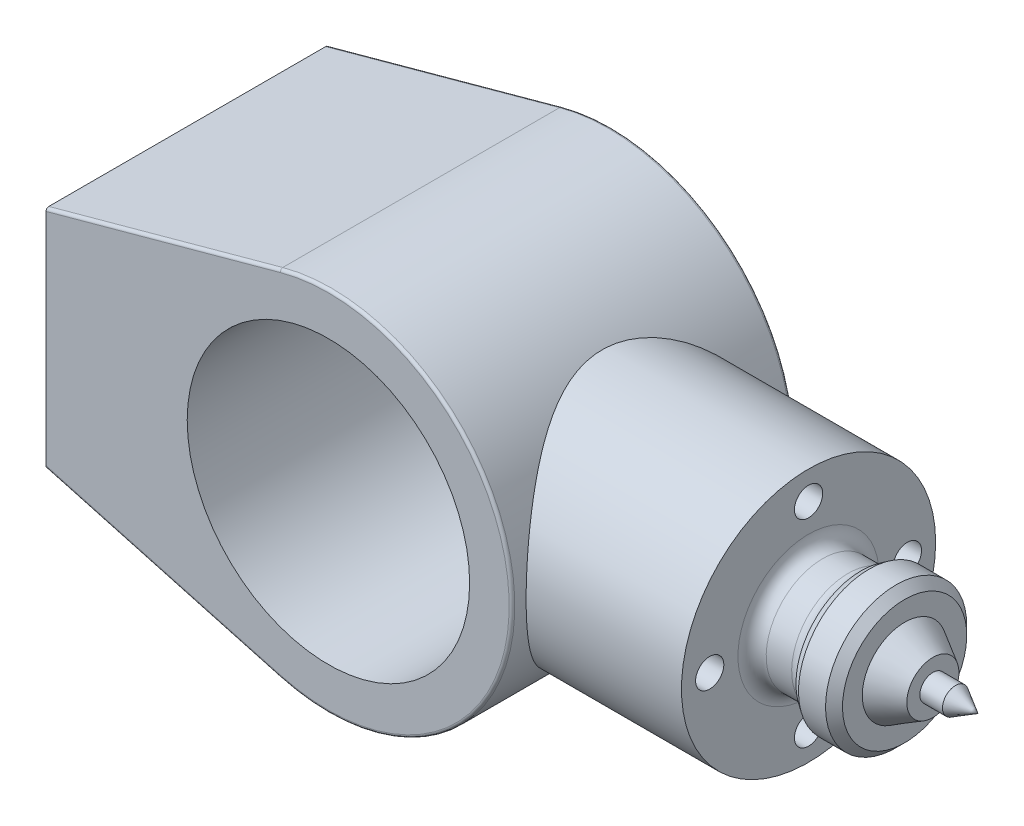
ISO-10303-21;
HEADER;
FILE_DESCRIPTION(('STEP AP214'),'2;1');
FILE_NAME('part.step','',(''),(''),'','','');
FILE_SCHEMA(('AUTOMOTIVE_DESIGN { 1 0 10303 214 1 1 1 1 }'));
ENDSEC;
DATA;
#1=APPLICATION_CONTEXT('core data for automotive mechanical design processes');
#2=APPLICATION_PROTOCOL_DEFINITION('international standard','automotive_design',2000,#1);
#3=PRODUCT_CONTEXT('',#1,'mechanical');
#4=PRODUCT('Part','Part','',(#3));
#5=PRODUCT_RELATED_PRODUCT_CATEGORY('part','',(#4));
#6=PRODUCT_DEFINITION_FORMATION('','',#4);
#7=PRODUCT_DEFINITION_CONTEXT('part definition',#1,'design');
#8=PRODUCT_DEFINITION('design','',#6,#7);
#9=PRODUCT_DEFINITION_SHAPE('','',#8);
#10=(LENGTH_UNIT() NAMED_UNIT(*) SI_UNIT(.MILLI.,.METRE.));
#11=(NAMED_UNIT(*) PLANE_ANGLE_UNIT() SI_UNIT($,.RADIAN.));
#12=(NAMED_UNIT(*) SI_UNIT($,.STERADIAN.) SOLID_ANGLE_UNIT());
#13=UNCERTAINTY_MEASURE_WITH_UNIT(LENGTH_MEASURE(1.E-05),#10,'distance_accuracy_value','');
#14=(GEOMETRIC_REPRESENTATION_CONTEXT(3) GLOBAL_UNCERTAINTY_ASSIGNED_CONTEXT((#13)) GLOBAL_UNIT_ASSIGNED_CONTEXT((#10,
#11,#12)) REPRESENTATION_CONTEXT('',''));
#15=CARTESIAN_POINT('',(0.,0.,0.));
#16=DIRECTION('',(0.,0.,1.));
#17=DIRECTION('',(1.,0.,0.));
#18=AXIS2_PLACEMENT_3D('',#15,#16,#17);
#19=CARTESIAN_POINT('',(0.,0.,50.));
#20=DIRECTION('',(0.,0.,1.));
#21=DIRECTION('',(1.,0.,0.));
#22=AXIS2_PLACEMENT_3D('',#19,#20,#21);
#23=PLANE('',#22);
#24=DIRECTION('',(0.,-1.,0.));
#25=VECTOR('',#24,1.);
#26=CARTESIAN_POINT('',(-100.,-40.,50.));
#27=LINE('',#26,#25);
#28=CARTESIAN_POINT('',(-100.,38.9631546288036,50.));
#29=VERTEX_POINT('',#28);
#30=CARTESIAN_POINT('',(-100.,-38.9631546288037,50.));
#31=VERTEX_POINT('',#30);
#32=EDGE_CURVE('E296',#29,#31,#27,.T.);
#33=ORIENTED_EDGE('',*,*,#32,.T.);
#34=DIRECTION('',(0.964463967125762,-0.264214413149695,0.));
#35=VECTOR('',#34,1.);
#36=CARTESIAN_POINT('',(-16.9097224415805,-61.7256938960488,50.));
#37=LINE('',#36,#35);
#38=CARTESIAN_POINT('',(-16.9097224415805,-61.7256938960488,50.));
#39=VERTEX_POINT('',#38);
#40=EDGE_CURVE('E248',#31,#39,#37,.T.);
#41=ORIENTED_EDGE('',*,*,#40,.T.);
#42=CARTESIAN_POINT('',(0.,0.,50.));
#43=DIRECTION('',(0.,0.,1.));
#44=DIRECTION('',(1.,0.,0.));
#45=AXIS2_PLACEMENT_3D('',#42,#43,#44);
#46=CIRCLE('',#45,64.);
#47=CARTESIAN_POINT('',(-16.9097224415805,61.7256938960488,50.));
#48=VERTEX_POINT('',#47);
#49=EDGE_CURVE('E64',#39,#48,#46,.T.);
#50=ORIENTED_EDGE('',*,*,#49,.T.);
#51=DIRECTION('',(-0.964463967125762,-0.264214413149696,0.));
#52=VECTOR('',#51,1.);
#53=CARTESIAN_POINT('',(-99.7357855868503,39.0355360328742,50.));
#54=LINE('',#53,#52);
#55=EDGE_CURVE('E251',#48,#29,#54,.T.);
#56=ORIENTED_EDGE('',*,*,#55,.T.);
#57=EDGE_LOOP('',(#33,#41,#50,#56));
#58=FACE_BOUND('',#57,.T.);
#59=CARTESIAN_POINT('',(0.,0.,50.));
#60=DIRECTION('',(0.,0.,1.));
#61=DIRECTION('',(1.,0.,0.));
#62=AXIS2_PLACEMENT_3D('',#59,#60,#61);
#63=CIRCLE('',#62,50.);
#64=CARTESIAN_POINT('',(50.,0.,50.));
#65=VERTEX_POINT('',#64);
#66=EDGE_CURVE('E300',#65,#65,#63,.T.);
#67=ORIENTED_EDGE('',*,*,#66,.F.);
#68=EDGE_LOOP('',(#67));
#69=FACE_BOUND('',#68,.T.);
#70=ADVANCED_FACE('F41',(#58,#69),#23,.T.);
#71=CARTESIAN_POINT('',(0.,0.,-50.));
#72=DIRECTION('',(0.,0.,1.));
#73=DIRECTION('',(1.,0.,0.));
#74=AXIS2_PLACEMENT_3D('',#71,#72,#73);
#75=PLANE('',#74);
#76=CARTESIAN_POINT('',(0.,0.,-50.));
#77=DIRECTION('',(0.,0.,1.));
#78=DIRECTION('',(1.,0.,0.));
#79=AXIS2_PLACEMENT_3D('',#76,#77,#78);
#80=CIRCLE('',#79,64.);
#81=CARTESIAN_POINT('',(-16.9097224415805,61.7256938960488,-50.));
#82=VERTEX_POINT('',#81);
#83=CARTESIAN_POINT('',(-16.9097224415805,-61.7256938960488,-50.));
#84=VERTEX_POINT('',#83);
#85=EDGE_CURVE('E269',#82,#84,#80,.F.);
#86=ORIENTED_EDGE('',*,*,#85,.T.);
#87=DIRECTION('',(0.964463967125762,-0.264214413149695,0.));
#88=VECTOR('',#87,1.);
#89=CARTESIAN_POINT('',(-16.9097224415805,-61.7256938960488,-50.));
#90=LINE('',#89,#88);
#91=CARTESIAN_POINT('',(-100.,-38.9631546288037,-50.));
#92=VERTEX_POINT('',#91);
#93=EDGE_CURVE('E265',#84,#92,#90,.F.);
#94=ORIENTED_EDGE('',*,*,#93,.T.);
#95=DIRECTION('',(0.,-1.,0.));
#96=VECTOR('',#95,1.);
#97=CARTESIAN_POINT('',(-100.,-40.,-50.));
#98=LINE('',#97,#96);
#99=CARTESIAN_POINT('',(-100.,38.9631546288037,-50.));
#100=VERTEX_POINT('',#99);
#101=EDGE_CURVE('E297',#100,#92,#98,.T.);
#102=ORIENTED_EDGE('',*,*,#101,.F.);
#103=DIRECTION('',(-0.964463967125762,-0.264214413149696,0.));
#104=VECTOR('',#103,1.);
#105=CARTESIAN_POINT('',(-16.9097224415805,61.7256938960488,-50.));
#106=LINE('',#105,#104);
#107=EDGE_CURVE('E267',#100,#82,#106,.F.);
#108=ORIENTED_EDGE('',*,*,#107,.T.);
#109=EDGE_LOOP('',(#86,#94,#102,#108));
#110=FACE_BOUND('',#109,.T.);
#111=CARTESIAN_POINT('',(0.,0.,-50.));
#112=DIRECTION('',(0.,0.,1.));
#113=DIRECTION('',(1.,0.,0.));
#114=AXIS2_PLACEMENT_3D('',#111,#112,#113);
#115=CIRCLE('',#114,50.);
#116=CARTESIAN_POINT('',(50.,0.,-50.));
#117=VERTEX_POINT('',#116);
#118=EDGE_CURVE('E302',#117,#117,#115,.T.);
#119=ORIENTED_EDGE('',*,*,#118,.T.);
#120=EDGE_LOOP('',(#119));
#121=FACE_BOUND('',#120,.T.);
#122=ADVANCED_FACE('F156',(#110,#121),#75,.F.);
#123=CARTESIAN_POINT('',(-100.,40.,50.));
#124=DIRECTION('',(0.264214413149696,-0.964463967125762,0.));
#125=DIRECTION('',(0.964463967125762,0.264214413149696,0.));
#126=AXIS2_PLACEMENT_3D('',#123,#124,#125);
#127=PLANE('',#126);
#128=DIRECTION('',(0.,0.,-1.));
#129=VECTOR('',#128,1.);
#130=CARTESIAN_POINT('',(-17.1739368547302,62.6901578631745,50.));
#131=LINE('',#130,#129);
#132=CARTESIAN_POINT('',(-17.1739368547302,62.6901578631745,49.));
#133=VERTEX_POINT('',#132);
#134=CARTESIAN_POINT('',(-17.1739368547302,62.6901578631745,-49.));
#135=VERTEX_POINT('',#134);
#136=EDGE_CURVE('E293',#133,#135,#131,.T.);
#137=ORIENTED_EDGE('',*,*,#136,.T.);
#138=DIRECTION('',(-0.964463967125762,-0.264214413149696,0.));
#139=VECTOR('',#138,1.);
#140=CARTESIAN_POINT('',(-100.,40.,-49.));
#141=LINE('',#140,#139);
#142=CARTESIAN_POINT('',(-100.,40.,-49.));
#143=VERTEX_POINT('',#142);
#144=EDGE_CURVE('E253',#135,#143,#141,.T.);
#145=ORIENTED_EDGE('',*,*,#144,.T.);
#146=DIRECTION('',(0.,0.,-1.));
#147=VECTOR('',#146,1.);
#148=CARTESIAN_POINT('',(-100.,40.,50.));
#149=LINE('',#148,#147);
#150=CARTESIAN_POINT('',(-100.,40.,49.));
#151=VERTEX_POINT('',#150);
#152=EDGE_CURVE('E284',#151,#143,#149,.T.);
#153=ORIENTED_EDGE('',*,*,#152,.F.);
#154=DIRECTION('',(-0.964463967125762,-0.264214413149696,0.));
#155=VECTOR('',#154,1.);
#156=CARTESIAN_POINT('',(-17.1739368547302,62.6901578631745,49.));
#157=LINE('',#156,#155);
#158=EDGE_CURVE('E255',#151,#133,#157,.F.);
#159=ORIENTED_EDGE('',*,*,#158,.T.);
#160=EDGE_LOOP('',(#137,#145,#153,#159));
#161=FACE_BOUND('',#160,.T.);
#162=ADVANCED_FACE('F161',(#161),#127,.F.);
#163=CARTESIAN_POINT('',(-100.,-40.,50.));
#164=DIRECTION('',(1.,0.,0.));
#165=DIRECTION('',(0.,1.,0.));
#166=AXIS2_PLACEMENT_3D('',#163,#164,#165);
#167=PLANE('',#166);
#168=ORIENTED_EDGE('',*,*,#101,.T.);
#169=CARTESIAN_POINT('',(-100.,-38.9631546288037,-49.));
#170=DIRECTION('',(1.,0.,0.));
#171=DIRECTION('',(0.,-1.,0.));
#172=AXIS2_PLACEMENT_3D('',#169,#170,#171);
#173=ELLIPSE('',#172,1.03684537119634,1.);
#174=CARTESIAN_POINT('',(-100.,-40.,-49.));
#175=VERTEX_POINT('',#174);
#176=EDGE_CURVE('E257',#92,#175,#173,.F.);
#177=ORIENTED_EDGE('',*,*,#176,.T.);
#178=DIRECTION('',(0.,0.,-1.));
#179=VECTOR('',#178,1.);
#180=CARTESIAN_POINT('',(-100.,-40.,50.));
#181=LINE('',#180,#179);
#182=CARTESIAN_POINT('',(-100.,-40.,49.));
#183=VERTEX_POINT('',#182);
#184=EDGE_CURVE('E287',#183,#175,#181,.T.);
#185=ORIENTED_EDGE('',*,*,#184,.F.);
#186=CARTESIAN_POINT('',(-100.,-38.9631546288037,49.));
#187=DIRECTION('',(1.,0.,0.));
#188=DIRECTION('',(0.,1.,0.));
#189=AXIS2_PLACEMENT_3D('',#186,#187,#188);
#190=ELLIPSE('',#189,1.03684537119634,1.);
#191=EDGE_CURVE('E261',#183,#31,#190,.F.);
#192=ORIENTED_EDGE('',*,*,#191,.T.);
#193=ORIENTED_EDGE('',*,*,#32,.F.);
#194=CARTESIAN_POINT('',(-100.,38.9631546288037,49.));
#195=DIRECTION('',(1.,0.,0.));
#196=DIRECTION('',(0.,1.,0.));
#197=AXIS2_PLACEMENT_3D('',#194,#195,#196);
#198=ELLIPSE('',#197,1.03684537119634,1.);
#199=EDGE_CURVE('E263',#29,#151,#198,.F.);
#200=ORIENTED_EDGE('',*,*,#199,.T.);
#201=ORIENTED_EDGE('',*,*,#152,.T.);
#202=CARTESIAN_POINT('',(-100.,38.9631546288037,-49.));
#203=DIRECTION('',(1.,0.,0.));
#204=DIRECTION('',(0.,-1.,0.));
#205=AXIS2_PLACEMENT_3D('',#202,#203,#204);
#206=ELLIPSE('',#205,1.03684537119634,1.);
#207=EDGE_CURVE('E259',#143,#100,#206,.F.);
#208=ORIENTED_EDGE('',*,*,#207,.T.);
#209=EDGE_LOOP('',(#168,#177,#185,#192,#193,#200,#201,#208));
#210=FACE_BOUND('',#209,.T.);
#211=ADVANCED_FACE('F173',(#210),#167,.F.);
#212=CARTESIAN_POINT('',(-100.,-40.,50.));
#213=DIRECTION('',(0.264214413149695,0.964463967125762,0.));
#214=DIRECTION('',(-0.964463967125762,0.264214413149695,0.));
#215=AXIS2_PLACEMENT_3D('',#212,#213,#214);
#216=PLANE('',#215);
#217=ORIENTED_EDGE('',*,*,#184,.T.);
#218=DIRECTION('',(0.964463967125762,-0.264214413149695,0.));
#219=VECTOR('',#218,1.);
#220=CARTESIAN_POINT('',(-100.,-40.,-49.));
#221=LINE('',#220,#219);
#222=CARTESIAN_POINT('',(-17.1739368547302,-62.6901578631745,-49.));
#223=VERTEX_POINT('',#222);
#224=EDGE_CURVE('E271',#175,#223,#221,.T.);
#225=ORIENTED_EDGE('',*,*,#224,.T.);
#226=DIRECTION('',(0.,0.,-1.));
#227=VECTOR('',#226,1.);
#228=CARTESIAN_POINT('',(-17.1739368547302,-62.6901578631745,50.));
#229=LINE('',#228,#227);
#230=CARTESIAN_POINT('',(-17.1739368547302,-62.6901578631745,49.));
#231=VERTEX_POINT('',#230);
#232=EDGE_CURVE('E290',#231,#223,#229,.T.);
#233=ORIENTED_EDGE('',*,*,#232,.F.);
#234=DIRECTION('',(0.964463967125762,-0.264214413149695,0.));
#235=VECTOR('',#234,1.);
#236=CARTESIAN_POINT('',(-100.,-40.,49.));
#237=LINE('',#236,#235);
#238=EDGE_CURVE('E274',#231,#183,#237,.F.);
#239=ORIENTED_EDGE('',*,*,#238,.T.);
#240=EDGE_LOOP('',(#217,#225,#233,#239));
#241=FACE_BOUND('',#240,.T.);
#242=ADVANCED_FACE('F169',(#241),#216,.F.);
#243=CARTESIAN_POINT('',(0.,0.,50.));
#244=DIRECTION('',(0.,0.,-1.));
#245=DIRECTION('',(-1.,0.,0.));
#246=AXIS2_PLACEMENT_3D('',#243,#244,#245);
#247=CYLINDRICAL_SURFACE('',#246,65.);
#248=CARTESIAN_POINT('',(65.,0.,-45.));
#249=CARTESIAN_POINT('',(65.0000011696057,1.12147330120565,-45.0000012025283));
#250=CARTESIAN_POINT('',(64.9709159765213,2.24292945230778,-44.9580201602482));
#251=CARTESIAN_POINT('',(64.8553068641383,4.47658414079083,-44.790785609369));
#252=CARTESIAN_POINT('',(64.7687842573088,5.58878288911932,-44.6655340035371));
#253=CARTESIAN_POINT('',(64.5403785763002,7.79555151848628,-44.3336771879691));
#254=CARTESIAN_POINT('',(64.3984760503456,8.89011506447751,-44.1270433931238));
#255=CARTESIAN_POINT('',(64.0626457436966,11.0533096019768,-43.6354760134034));
#256=CARTESIAN_POINT('',(63.8687169569864,12.1219400915896,-43.3505409144375));
#257=CARTESIAN_POINT('',(63.4342222744663,14.2212125160506,-42.7078017297046));
#258=CARTESIAN_POINT('',(63.1938918545645,15.2520162370063,-42.3503651251477));
#259=CARTESIAN_POINT('',(62.6709259446924,17.2756280115287,-41.5659763086892));
#260=CARTESIAN_POINT('',(62.3882907364915,18.268436318107,-41.1390245597888));
#261=CARTESIAN_POINT('',(61.7861085539321,20.2116697228795,-40.2199419970838));
#262=CARTESIAN_POINT('',(61.4665619062632,21.1620951960855,-39.7278117601444));
#263=CARTESIAN_POINT('',(60.7962171584065,23.0172309124315,-38.6825647509799));
#264=CARTESIAN_POINT('',(60.4454175300334,23.9219389167185,-38.1294449962195));
#265=CARTESIAN_POINT('',(59.6865648974474,25.7601880140228,-36.9151737617935));
#266=CARTESIAN_POINT('',(59.27618815402,26.6893215363404,-36.2488040005491));
#267=CARTESIAN_POINT('',(58.4330275057249,28.4880338622967,-34.8529502059224));
#268=CARTESIAN_POINT('',(58.0002425478182,29.3576098626539,-34.1234632053608));
#269=CARTESIAN_POINT('',(57.1195111836478,31.0364486388513,-32.6040251352403));
#270=CARTESIAN_POINT('',(56.6715447181891,31.8456267033452,-31.8139921794122));
#271=CARTESIAN_POINT('',(55.7691986061138,33.4006700551814,-30.1773036556993));
#272=CARTESIAN_POINT('',(55.3148185876119,34.1465316534289,-29.330644793672));
#273=CARTESIAN_POINT('',(54.3303114345595,35.6959084068904,-27.4326466159467));
#274=CARTESIAN_POINT('',(53.8005937511269,36.4872853280241,-26.3711450656526));
#275=CARTESIAN_POINT('',(52.7593327891933,37.9773509509911,-24.17604025639));
#276=CARTESIAN_POINT('',(52.2477941160227,38.6760162868262,-23.0424189272517));
#277=CARTESIAN_POINT('',(51.2608149265044,39.9749077721744,-20.7072341856928));
#278=CARTESIAN_POINT('',(50.7853275075273,40.5752630453964,-19.5057627267966));
#279=CARTESIAN_POINT('',(49.8892399163793,41.6721166930025,-17.036931864064));
#280=CARTESIAN_POINT('',(49.4686114171659,42.1686687478853,-15.7696069409943));
#281=CARTESIAN_POINT('',(48.8208029416879,42.9149535309565,-13.5723996352816));
#282=CARTESIAN_POINT('',(48.5738420263558,43.1936925213245,-12.6581208440976));
#283=CARTESIAN_POINT('',(48.1238801744123,43.6944569649788,-10.803538922355));
#284=CARTESIAN_POINT('',(47.920872102193,43.9164916250901,-9.86324004407417));
#285=CARTESIAN_POINT('',(47.5660754926548,44.3005296261305,-7.96250438663407));
#286=CARTESIAN_POINT('',(47.4142038087044,44.4626304606427,-7.00210302149485));
#287=CARTESIAN_POINT('',(47.1671263845177,44.7246555122386,-5.06554052628515));
#288=CARTESIAN_POINT('',(47.071920625953,44.824579749433,-4.08937940131222));
#289=CARTESIAN_POINT('',(46.9418899090944,44.9607388198673,-2.12323648479669));
#290=CARTESIAN_POINT('',(46.9073939345417,44.9966266570423,-1.13320851844657));
#291=CARTESIAN_POINT('',(46.9013571135477,45.0029190462422,0.84724837709386));
#292=CARTESIAN_POINT('',(46.9298161498632,44.9733237202183,1.83767730553401));
#293=CARTESIAN_POINT('',(47.0484302849821,44.8492190899201,3.81128752429083));
#294=CARTESIAN_POINT('',(47.1386230552101,44.7546701492421,4.79446401850663));
#295=CARTESIAN_POINT('',(47.376831317608,44.5024241630868,6.74551496467457));
#296=CARTESIAN_POINT('',(47.5248480621438,44.3447257499009,7.71338908473169));
#297=CARTESIAN_POINT('',(47.8621764271841,43.9803320764262,9.56919366964686));
#298=CARTESIAN_POINT('',(48.0484149088864,43.7772163066585,10.4583970625519));
#299=CARTESIAN_POINT('',(48.4609441046406,43.32010640119,12.2144143492181));
#300=CARTESIAN_POINT('',(48.6872496045115,43.0660934784814,13.0812198417583));
#301=CARTESIAN_POINT('',(49.1738509640383,42.5096331932465,14.7898225666927));
#302=CARTESIAN_POINT('',(49.4341648638834,42.2071601049958,15.6316062329481));
#303=CARTESIAN_POINT('',(49.9825182796335,41.5563350032135,17.2876417419013));
#304=CARTESIAN_POINT('',(50.2705534011697,41.2079902580444,18.1018979206949));
#305=CARTESIAN_POINT('',(51.0225431471345,40.2767822129268,20.1137766396802));
#306=CARTESIAN_POINT('',(51.5007434523329,39.6654891440572,21.2930273345177));
#307=CARTESIAN_POINT('',(52.4891158781477,38.348029920852,23.5833678403921));
#308=CARTESIAN_POINT('',(52.9993005340589,37.6418264436726,24.6944305853524));
#309=CARTESIAN_POINT('',(54.0361557973494,36.1376496350166,26.8476775780095));
#310=CARTESIAN_POINT('',(54.5628535785461,35.3395185623559,27.8897384505711));
#311=CARTESIAN_POINT('',(55.6171804467178,33.6558443419671,29.8998791095632));
#312=CARTESIAN_POINT('',(56.1448094104418,32.7703120184234,30.8679680307498));
#313=CARTESIAN_POINT('',(57.1932449701135,30.9045304086319,32.7363921475658));
#314=CARTESIAN_POINT('',(57.7139191350983,29.9233731295192,33.6358963165067));
#315=CARTESIAN_POINT('',(58.7296419536465,27.8771206485979,35.350355349792));
#316=CARTESIAN_POINT('',(59.2246882700661,26.8120178135979,36.1653025097018));
#317=CARTESIAN_POINT('',(60.1756566955639,24.6035209522421,37.7024332048813));
#318=CARTESIAN_POINT('',(60.6316475651596,23.4602711709794,38.4247809320632));
#319=CARTESIAN_POINT('',(61.4931891608211,21.0989507187335,39.7703323765769));
#320=CARTESIAN_POINT('',(61.898755017873,19.8809026570889,40.3935658507715));
#321=CARTESIAN_POINT('',(62.5646802947783,17.6549035875762,41.4059204565395));
#322=CARTESIAN_POINT('',(62.8372982548467,16.6602403417733,41.8163120535009));
#323=CARTESIAN_POINT('',(63.3397164077328,14.6345031625144,42.5675669112335));
#324=CARTESIAN_POINT('',(63.5695225359981,13.603434299959,42.9084398107234));
#325=CARTESIAN_POINT('',(63.9815049902597,11.5110112910016,43.5164676119118));
#326=CARTESIAN_POINT('',(64.1637052650744,10.4496726714621,43.7836595836378));
#327=CARTESIAN_POINT('',(64.476639865795,8.30296993183372,44.2409869387356));
#328=CARTESIAN_POINT('',(64.6073730982257,7.21760530180254,44.431120684921));
#329=CARTESIAN_POINT('',(64.8147345736683,5.02649787175024,44.7321113931983));
#330=CARTESIAN_POINT('',(64.8911534961694,3.92069290489764,44.8426616714377));
#331=CARTESIAN_POINT('',(64.9872183357686,1.70145350776209,44.981563734156));
#332=CARTESIAN_POINT('',(65.0068642771874,0.588019080747705,45.0099155538474));
#333=CARTESIAN_POINT('',(64.9889001241945,-1.63741781931565,44.9839662509349));
#334=CARTESIAN_POINT('',(64.9512898349751,-2.74942028747966,44.929664847113));
#335=CARTESIAN_POINT('',(64.819734418053,-4.96298947367602,44.7392747901952));
#336=CARTESIAN_POINT('',(64.7257910494465,-6.06455651648126,44.6031886909653));
#337=CARTESIAN_POINT('',(64.491175703309,-8.18254449212148,44.2620157992034));
#338=CARTESIAN_POINT('',(64.3536808680178,-9.20007959997772,44.0616107864454));
#339=CARTESIAN_POINT('',(64.0337856060908,-11.2121337136588,43.5930613516679));
#340=CARTESIAN_POINT('',(63.85138738555,-12.2066538475799,43.3249202574929));
#341=CARTESIAN_POINT('',(63.4451725249075,-14.1673074608523,42.7239854011605));
#342=CARTESIAN_POINT('',(63.2213525684632,-15.1334386601222,42.3911864622048));
#343=CARTESIAN_POINT('',(62.7363363526771,-17.0327019487273,41.6643868113868));
#344=CARTESIAN_POINT('',(62.4751380044848,-17.965832190203,41.2703826790343));
#345=CARTESIAN_POINT('',(61.8990085085122,-19.8637431772395,40.3931275129008));
#346=CARTESIAN_POINT('',(61.5815209528501,-20.8256806929253,39.9054081529014));
#347=CARTESIAN_POINT('',(60.9142086391395,-22.7035764997345,38.8677076181211));
#348=CARTESIAN_POINT('',(60.5643826081083,-23.6195329786528,38.3177239921568));
#349=CARTESIAN_POINT('',(59.8381347129401,-25.4032558353403,37.1592008079418));
#350=CARTESIAN_POINT('',(59.4616987975441,-26.270996314329,36.5506302507532));
#351=CARTESIAN_POINT('',(58.6884577670336,-27.9557544991496,35.2787474176625));
#352=CARTESIAN_POINT('',(58.2916515549571,-28.7727694681138,34.6154321925309));
#353=CARTESIAN_POINT('',(57.4151711853793,-30.4889708749912,33.1199200847161));
#354=CARTESIAN_POINT('',(56.9328754552547,-31.3785212006928,32.2781812569548));
#355=CARTESIAN_POINT('',(55.9590893109094,-33.083904221517,30.5278352445589));
#356=CARTESIAN_POINT('',(55.467597542125,-33.8997259516808,29.6192181500899));
#357=CARTESIAN_POINT('',(54.4860350387397,-35.45586994741,27.7375714933992));
#358=CARTESIAN_POINT('',(53.9959654596118,-36.1961418986443,26.7644997080006));
#359=CARTESIAN_POINT('',(53.0294834997435,-37.5978502361012,24.7568233036381));
#360=CARTESIAN_POINT('',(52.553069328415,-38.2592969946585,23.7222268074148));
#361=CARTESIAN_POINT('',(51.6799413477261,-39.4291013564639,21.7149007388747));
#362=CARTESIAN_POINT('',(51.2803372484816,-39.9463152685162,20.7485884228094));
#363=CARTESIAN_POINT('',(50.5123974548912,-40.913063666173,18.7705314851885));
#364=CARTESIAN_POINT('',(50.1440619804653,-41.3625976757848,17.7587865441704));
#365=CARTESIAN_POINT('',(49.4504928922364,-42.1893301292689,15.693797265063));
#366=CARTESIAN_POINT('',(49.1251906412473,-42.566644202947,14.6406225749502));
#367=CARTESIAN_POINT('',(48.5290098021012,-43.2451098617227,12.4950157035288));
#368=CARTESIAN_POINT('',(48.2581179989953,-43.5462799449171,11.4025931307277));
#369=CARTESIAN_POINT('',(47.8271610412376,-44.018687486118,9.3921629994351));
#370=CARTESIAN_POINT('',(47.6558419905219,-44.2036946073207,8.4797935357042));
#371=CARTESIAN_POINT('',(47.3627606953032,-44.517583244497,6.63757582668246));
#372=CARTESIAN_POINT('',(47.2409923142224,-44.6464717105955,5.70772976070374));
#373=CARTESIAN_POINT('',(47.05166615705,-44.8459556683364,3.83718735816971));
#374=CARTESIAN_POINT('',(46.9840561376509,-44.9166073394187,2.89650236820514));
#375=CARTESIAN_POINT('',(46.9055698265682,-44.9985645522097,1.01014116515035));
#376=CARTESIAN_POINT('',(46.8946943314281,-45.0098692606967,0.0644648821697848));
#377=CARTESIAN_POINT('',(46.9301408777119,-44.972908524549,-1.82506201386805));
#378=CARTESIAN_POINT('',(46.9764888551696,-44.9246160680299,-2.76891160474203));
#379=CARTESIAN_POINT('',(47.1245232303033,-44.7693052695385,-4.64731891289864));
#380=CARTESIAN_POINT('',(47.226209296244,-44.6622872796082,-5.58187668584875));
#381=CARTESIAN_POINT('',(47.4811423262629,-44.3911660407895,-7.4366659860656));
#382=CARTESIAN_POINT('',(47.634452919394,-44.2269923369625,-8.35687836049678));
#383=CARTESIAN_POINT('',(47.9871889035598,-43.8440109221367,-10.1768310643423));
#384=CARTESIAN_POINT('',(48.1866204648689,-43.6251959006593,-11.0765686368372));
#385=CARTESIAN_POINT('',(48.6908782922366,-43.0625185245671,-13.116726178063));
#386=CARTESIAN_POINT('',(49.00939723506,-42.7008255731353,-14.2488681052183));
#387=CARTESIAN_POINT('',(49.699554494161,-41.8955268796886,-16.4668795226373));
#388=CARTESIAN_POINT('',(50.0712093704163,-41.4518955887103,-17.5527344499461));
#389=CARTESIAN_POINT('',(50.8544123719763,-40.4872212981013,-19.6760329984318));
#390=CARTESIAN_POINT('',(51.2660067549033,-39.9660881554129,-20.7134183727638));
#391=CARTESIAN_POINT('',(52.116211879306,-38.8508952329155,-22.7363587217865));
#392=CARTESIAN_POINT('',(52.5548209260535,-38.2568400254561,-23.7219169406072));
#393=CARTESIAN_POINT('',(53.4579357785503,-36.9847423381263,-25.6613286822633));
#394=CARTESIAN_POINT('',(53.9228021101372,-36.3051118639051,-26.6139712103077));
#395=CARTESIAN_POINT('',(54.8583333343946,-34.8753950985048,-28.4617532840731));
#396=CARTESIAN_POINT('',(55.3289982185488,-34.1253089107936,-29.3568929142368));
#397=CARTESIAN_POINT('',(56.2664339133503,-32.5564691651912,-31.0876310121466));
#398=CARTESIAN_POINT('',(56.733203509343,-31.7376950080829,-31.923211478402));
#399=CARTESIAN_POINT('',(57.6535165855435,-30.033481652025,-33.5315189390535));
#400=CARTESIAN_POINT('',(58.1070588196762,-29.1480362003111,-34.3042400240121));
#401=CARTESIAN_POINT('',(59.0635284336244,-27.1643113596245,-35.9022819462667));
#402=CARTESIAN_POINT('',(59.5626106290919,-26.0547472869609,-36.7159606163356));
#403=CARTESIAN_POINT('',(60.5176757229357,-23.7521280348398,-38.2458641369291));
#404=CARTESIAN_POINT('',(60.9736519283074,-22.5590599397198,-38.962073861155));
#405=CARTESIAN_POINT('',(61.6149926579414,-20.7127348127311,-39.9558623322098));
#406=CARTESIAN_POINT('',(61.8215919655179,-20.088110583999,-40.2735888165198));
#407=CARTESIAN_POINT('',(62.2191547005857,-18.8206694867556,-40.8812436548858));
#408=CARTESIAN_POINT('',(62.4101203779566,-18.1778552539997,-41.1711760099034));
#409=CARTESIAN_POINT('',(62.7748527233684,-16.875283117665,-41.7219931318356));
#410=CARTESIAN_POINT('',(62.9486230408552,-16.2155288469421,-41.9828840638124));
#411=CARTESIAN_POINT('',(63.2775356475737,-14.8804011558234,-42.4744610119283));
#412=CARTESIAN_POINT('',(63.432679284421,-14.2050288695917,-42.7051492133046));
#413=CARTESIAN_POINT('',(63.8070721968101,-12.4447010544915,-43.25974494481));
#414=CARTESIAN_POINT('',(64.0114184468014,-11.3490405228654,-43.5602757498286));
#415=CARTESIAN_POINT('',(64.3654191982088,-9.12991345978803,-44.0788276443961));
#416=CARTESIAN_POINT('',(64.5150820049425,-8.00645117856258,-44.2968612637911));
#417=CARTESIAN_POINT('',(64.7559993187062,-5.74082253729115,-44.6470112993716));
#418=CARTESIAN_POINT('',(64.847297757104,-4.59867091062176,-44.7791923387443));
#419=CARTESIAN_POINT('',(64.9692976296881,-2.30434018473199,-44.9556862638234));
#420=CARTESIAN_POINT('',(64.9999987983896,-1.15216104160191,-44.999998764566));
#421=CARTESIAN_POINT('',(65.,0.,-45.));
#422=B_SPLINE_CURVE_WITH_KNOTS('',3,(#248,#249,#250,#251,#252,#253,#254,#255,#256,#257,#258,
#259,#260,#261,#262,#263,#264,#265,#266,#267,#268,#269,#270,#271,#272,#273,#274,#275,#276,#277,
#278,#279,#280,#281,#282,#283,#284,#285,#286,#287,#288,#289,#290,#291,#292,#293,#294,#295,#296,
#297,#298,#299,#300,#301,#302,#303,#304,#305,#306,#307,#308,#309,#310,#311,#312,#313,#314,#315,
#316,#317,#318,#319,#320,#321,#322,#323,#324,#325,#326,#327,#328,#329,#330,#331,#332,#333,#334,
#335,#336,#337,#338,#339,#340,#341,#342,#343,#344,#345,#346,#347,#348,#349,#350,#351,#352,#353,
#354,#355,#356,#357,#358,#359,#360,#361,#362,#363,#364,#365,#366,#367,#368,#369,#370,#371,#372,
#373,#374,#375,#376,#377,#378,#379,#380,#381,#382,#383,#384,#385,#386,#387,#388,#389,#390,#391,
#392,#393,#394,#395,#396,#397,#398,#399,#400,#401,#402,#403,#404,#405,#406,#407,#408,#409,#410,
#411,#412,#413,#414,#415,#416,#417,#418,#419,#420,#421),.UNSPECIFIED.,.T.,.F.,(4,2,2,2,2,2,2,2,
2,2,2,2,2,2,2,2,2,2,2,2,2,2,2,2,2,2,2,2,2,2,2,2,2,2,2,2,2,2,2,2,2,2,2,2,2,2,2,2,2,2,2,2,2,2,2,2,
2,2,2,2,2,2,2,2,2,2,2,2,2,2,2,2,2,2,2,2,2,2,2,2,2,2,2,2,2,2,4),(0.,3.36323892794144,
6.72640100710137,10.0907454360665,13.4551549250109,16.8029195613731,20.1506619010729,
23.4983746134034,26.8462511096753,30.4871649037347,34.1282499524345,37.7743494260164,
41.4206611917409,45.6939383064405,49.9682903731881,54.2369825353393,58.5034617073672,
61.4625138492406,64.4210852373372,67.3748225577202,70.3285589227264,73.2982527376573,
76.2679410220408,79.2394430998938,82.2110095388412,85.0011411726389,87.7923045951578,
90.584954683776,93.3771628083065,97.6064034875675,101.837312178738,106.075592113262,
110.313347816192,114.596218662803,118.879479402292,123.155037051935,127.429308626693,
130.755998382163,134.082226580387,137.406778235214,140.731400520075,144.068767009318,
147.406132068879,150.743508483461,154.080780688207,157.215791533369,160.350648386749,
163.485756334407,166.621039552604,169.990545063149,173.360183268584,176.73161428665,
180.103227050672,184.047902440152,187.993163521895,191.94103513809,195.888386692538,
199.385185586645,202.88200907258,206.373186157811,209.863514294626,212.700365177753,
215.536864625513,218.370624567028,221.204424293963,224.039508887241,226.874576485218,
229.713151272815,232.55210603787,236.23803941247,239.925124033801,243.616531168718,
247.307706963636,251.081871120678,254.856029735252,258.631324277359,262.406973327354,
266.792058434818,271.177823293658,273.368885604935,275.55963203795,277.749912517597,
279.940034437727,283.398420446896,286.856280978073,290.31153567335,293.766805506531),.UNSPECIFIED.);
#423=CARTESIAN_POINT('',(65.,0.,-45.));
#424=VERTEX_POINT('',#423);
#425=EDGE_CURVE('E121',#424,#424,#422,.T.);
#426=ORIENTED_EDGE('',*,*,#425,.F.);
#427=EDGE_LOOP('',(#426));
#428=FACE_BOUND('',#427,.T.);
#429=ORIENTED_EDGE('',*,*,#136,.F.);
#430=CARTESIAN_POINT('',(0.,0.,49.));
#431=DIRECTION('',(0.,0.,1.));
#432=DIRECTION('',(1.,0.,0.));
#433=AXIS2_PLACEMENT_3D('',#430,#431,#432);
#434=CIRCLE('',#433,65.);
#435=EDGE_CURVE('E232',#133,#231,#434,.F.);
#436=ORIENTED_EDGE('',*,*,#435,.T.);
#437=ORIENTED_EDGE('',*,*,#232,.T.);
#438=CARTESIAN_POINT('',(0.,0.,-49.));
#439=DIRECTION('',(0.,0.,1.));
#440=DIRECTION('',(1.,0.,0.));
#441=AXIS2_PLACEMENT_3D('',#438,#439,#440);
#442=CIRCLE('',#441,65.);
#443=EDGE_CURVE('E246',#223,#135,#442,.T.);
#444=ORIENTED_EDGE('',*,*,#443,.T.);
#445=EDGE_LOOP('',(#429,#436,#437,#444));
#446=FACE_BOUND('',#445,.T.);
#447=ADVANCED_FACE('F153',(#428,#446),#247,.T.);
#448=CARTESIAN_POINT('',(0.,0.,50.));
#449=DIRECTION('',(0.,0.,-1.));
#450=DIRECTION('',(-1.,0.,0.));
#451=AXIS2_PLACEMENT_3D('',#448,#449,#450);
#452=CYLINDRICAL_SURFACE('',#451,50.);
#453=ORIENTED_EDGE('',*,*,#66,.T.);
#454=EDGE_LOOP('',(#453));
#455=FACE_BOUND('',#454,.T.);
#456=ORIENTED_EDGE('',*,*,#118,.F.);
#457=EDGE_LOOP('',(#456));
#458=FACE_BOUND('',#457,.T.);
#459=ADVANCED_FACE('F145',(#455,#458),#452,.F.);
#460=CARTESIAN_POINT('',(-100.002,0.,0.));
#461=DIRECTION('',(1.,0.,0.));
#462=DIRECTION('',(0.,0.,-1.));
#463=AXIS2_PLACEMENT_3D('',#460,#461,#462);
#464=CYLINDRICAL_SURFACE('',#463,45.);
#465=CARTESIAN_POINT('',(120.,0.,0.));
#466=DIRECTION('',(1.,0.,0.));
#467=DIRECTION('',(0.,0.,-1.));
#468=AXIS2_PLACEMENT_3D('',#465,#466,#467);
#469=CIRCLE('',#468,45.);
#470=CARTESIAN_POINT('',(120.,0.,-45.));
#471=VERTEX_POINT('',#470);
#472=EDGE_CURVE('E125',#471,#471,#469,.T.);
#473=ORIENTED_EDGE('',*,*,#472,.F.);
#474=EDGE_LOOP('',(#473));
#475=FACE_BOUND('',#474,.T.);
#476=ORIENTED_EDGE('',*,*,#425,.T.);
#477=EDGE_LOOP('',(#476));
#478=FACE_BOUND('',#477,.T.);
#479=ADVANCED_FACE('F116',(#475,#478),#464,.T.);
#480=CARTESIAN_POINT('',(120.,0.,0.));
#481=DIRECTION('',(1.,0.,0.));
#482=DIRECTION('',(0.,0.,-1.));
#483=AXIS2_PLACEMENT_3D('',#480,#481,#482);
#484=PLANE('',#483);
#485=CARTESIAN_POINT('',(120.,0.,0.));
#486=DIRECTION('',(1.,0.,0.));
#487=DIRECTION('',(0.,0.,-1.));
#488=AXIS2_PLACEMENT_3D('',#485,#486,#487);
#489=CIRCLE('',#488,25.);
#490=CARTESIAN_POINT('',(120.,0.,-25.));
#491=VERTEX_POINT('',#490);
#492=EDGE_CURVE('E282',#491,#491,#489,.F.);
#493=ORIENTED_EDGE('',*,*,#492,.T.);
#494=EDGE_LOOP('',(#493));
#495=FACE_BOUND('',#494,.T.);
#496=CARTESIAN_POINT('',(120.,35.,0.));
#497=DIRECTION('',(1.,0.,0.));
#498=DIRECTION('',(0.,0.,-1.));
#499=AXIS2_PLACEMENT_3D('',#496,#497,#498);
#500=CIRCLE('',#499,5.);
#501=CARTESIAN_POINT('',(120.,35.,-5.));
#502=VERTEX_POINT('',#501);
#503=EDGE_CURVE('E397',#502,#502,#500,.T.);
#504=ORIENTED_EDGE('',*,*,#503,.F.);
#505=EDGE_LOOP('',(#504));
#506=FACE_BOUND('',#505,.T.);
#507=CARTESIAN_POINT('',(120.,0.,-35.));
#508=DIRECTION('',(1.,0.,0.));
#509=DIRECTION('',(0.,0.,-1.));
#510=AXIS2_PLACEMENT_3D('',#507,#508,#509);
#511=CIRCLE('',#510,5.);
#512=CARTESIAN_POINT('',(120.,0.,-40.));
#513=VERTEX_POINT('',#512);
#514=EDGE_CURVE('E391',#513,#513,#511,.T.);
#515=ORIENTED_EDGE('',*,*,#514,.F.);
#516=EDGE_LOOP('',(#515));
#517=FACE_BOUND('',#516,.T.);
#518=CARTESIAN_POINT('',(120.,-35.,0.));
#519=DIRECTION('',(1.,0.,0.));
#520=DIRECTION('',(0.,0.,-1.));
#521=AXIS2_PLACEMENT_3D('',#518,#519,#520);
#522=CIRCLE('',#521,5.);
#523=CARTESIAN_POINT('',(120.,-35.,-5.));
#524=VERTEX_POINT('',#523);
#525=EDGE_CURVE('E385',#524,#524,#522,.T.);
#526=ORIENTED_EDGE('',*,*,#525,.F.);
#527=EDGE_LOOP('',(#526));
#528=FACE_BOUND('',#527,.T.);
#529=CARTESIAN_POINT('',(120.,0.,35.));
#530=DIRECTION('',(1.,0.,0.));
#531=DIRECTION('',(0.,0.,-1.));
#532=AXIS2_PLACEMENT_3D('',#529,#530,#531);
#533=CIRCLE('',#532,5.);
#534=CARTESIAN_POINT('',(120.,0.,30.));
#535=VERTEX_POINT('',#534);
#536=EDGE_CURVE('E243',#535,#535,#533,.T.);
#537=ORIENTED_EDGE('',*,*,#536,.F.);
#538=EDGE_LOOP('',(#537));
#539=FACE_BOUND('',#538,.T.);
#540=ORIENTED_EDGE('',*,*,#472,.T.);
#541=EDGE_LOOP('',(#540));
#542=FACE_BOUND('',#541,.T.);
#543=ADVANCED_FACE('F114',(#495,#506,#517,#528,#539,#542),#484,.T.);
#544=CARTESIAN_POINT('',(172.019237886467,0.,0.));
#545=DIRECTION('',(-1.,0.,0.));
#546=DIRECTION('',(0.,-1.,0.));
#547=AXIS2_PLACEMENT_3D('',#544,#545,#546);
#548=CONICAL_SURFACE('',#547,4.60769515458677,0.523598775598296);
#549=CARTESIAN_POINT('',(180.,0.,0.));
#550=VERTEX_POINT('',#549);
#551=VERTEX_LOOP('',#550);
#552=FACE_BOUND('',#551,.T.);
#553=CARTESIAN_POINT('',(172.019237886467,0.,0.));
#554=DIRECTION('',(-1.,0.,0.));
#555=DIRECTION('',(0.,-1.,0.));
#556=AXIS2_PLACEMENT_3D('',#553,#554,#555);
#557=CIRCLE('',#556,4.60769515458677);
#558=CARTESIAN_POINT('',(172.019237886467,-4.60769515458677,0.));
#559=VERTEX_POINT('',#558);
#560=EDGE_CURVE('E119',#559,#559,#557,.T.);
#561=ORIENTED_EDGE('',*,*,#560,.F.);
#562=EDGE_LOOP('',(#561));
#563=FACE_BOUND('',#562,.T.);
#564=ADVANCED_FACE('F110',(#552,#563),#548,.T.);
#565=CARTESIAN_POINT('',(120.,0.,0.));
#566=DIRECTION('',(-1.,0.,0.));
#567=DIRECTION('',(0.,-1.,0.));
#568=AXIS2_PLACEMENT_3D('',#565,#566,#567);
#569=CYLINDRICAL_SURFACE('',#568,4.60769515458677);
#570=ORIENTED_EDGE('',*,*,#560,.T.);
#571=EDGE_LOOP('',(#570));
#572=FACE_BOUND('',#571,.T.);
#573=CARTESIAN_POINT('',(164.019237886467,0.,0.));
#574=DIRECTION('',(-1.,0.,0.));
#575=DIRECTION('',(0.,-1.,0.));
#576=AXIS2_PLACEMENT_3D('',#573,#574,#575);
#577=CIRCLE('',#576,4.60769515458677);
#578=CARTESIAN_POINT('',(164.019237886467,-4.60769515458677,0.));
#579=VERTEX_POINT('',#578);
#580=EDGE_CURVE('E122',#579,#579,#577,.T.);
#581=ORIENTED_EDGE('',*,*,#580,.F.);
#582=EDGE_LOOP('',(#581));
#583=FACE_BOUND('',#582,.T.);
#584=ADVANCED_FACE('F113',(#572,#583),#569,.T.);
#585=CARTESIAN_POINT('',(164.019237886467,-4.60769515458677,0.));
#586=DIRECTION('',(1.,0.,0.));
#587=DIRECTION('',(0.,1.,0.));
#588=AXIS2_PLACEMENT_3D('',#585,#586,#587);
#589=PLANE('',#588);
#590=ORIENTED_EDGE('',*,*,#580,.T.);
#591=EDGE_LOOP('',(#590));
#592=FACE_BOUND('',#591,.T.);
#593=CARTESIAN_POINT('',(164.019237886467,0.,0.));
#594=DIRECTION('',(-1.,0.,0.));
#595=DIRECTION('',(0.,-1.,0.));
#596=AXIS2_PLACEMENT_3D('',#593,#594,#595);
#597=CIRCLE('',#596,9.22649730810375);
#598=CARTESIAN_POINT('',(164.019237886467,-9.22649730810375,0.));
#599=VERTEX_POINT('',#598);
#600=EDGE_CURVE('E128',#599,#599,#597,.T.);
#601=ORIENTED_EDGE('',*,*,#600,.F.);
#602=EDGE_LOOP('',(#601));
#603=FACE_BOUND('',#602,.T.);
#604=ADVANCED_FACE('F363',(#592,#603),#589,.T.);
#605=CARTESIAN_POINT('',(154.019237886467,0.,0.));
#606=DIRECTION('',(-1.,0.,0.));
#607=DIRECTION('',(0.,-1.,0.));
#608=AXIS2_PLACEMENT_3D('',#605,#606,#607);
#609=CONICAL_SURFACE('',#608,15.,0.523598775598296);
#610=ORIENTED_EDGE('',*,*,#600,.T.);
#611=EDGE_LOOP('',(#610));
#612=FACE_BOUND('',#611,.T.);
#613=CARTESIAN_POINT('',(154.019237886467,0.,0.));
#614=DIRECTION('',(-1.,0.,0.));
#615=DIRECTION('',(0.,-1.,0.));
#616=AXIS2_PLACEMENT_3D('',#613,#614,#615);
#617=CIRCLE('',#616,15.);
#618=CARTESIAN_POINT('',(154.019237886467,-15.,0.));
#619=VERTEX_POINT('',#618);
#620=EDGE_CURVE('E375',#619,#619,#617,.T.);
#621=ORIENTED_EDGE('',*,*,#620,.F.);
#622=EDGE_LOOP('',(#621));
#623=FACE_BOUND('',#622,.T.);
#624=ADVANCED_FACE('F359',(#612,#623),#609,.T.);
#625=CARTESIAN_POINT('',(154.019237886467,-15.,0.));
#626=DIRECTION('',(1.,0.,0.));
#627=DIRECTION('',(0.,1.,0.));
#628=AXIS2_PLACEMENT_3D('',#625,#626,#627);
#629=PLANE('',#628);
#630=CARTESIAN_POINT('',(154.019237886467,0.,0.));
#631=DIRECTION('',(1.,0.,0.));
#632=DIRECTION('',(0.,1.,0.));
#633=AXIS2_PLACEMENT_3D('',#630,#631,#632);
#634=CIRCLE('',#633,21.9999999999999);
#635=CARTESIAN_POINT('',(154.019237886467,21.9999999999999,0.));
#636=VERTEX_POINT('',#635);
#637=EDGE_CURVE('E50',#636,#636,#634,.T.);
#638=ORIENTED_EDGE('',*,*,#637,.T.);
#639=EDGE_LOOP('',(#638));
#640=FACE_BOUND('',#639,.T.);
#641=ORIENTED_EDGE('',*,*,#620,.T.);
#642=EDGE_LOOP('',(#641));
#643=FACE_BOUND('',#642,.T.);
#644=ADVANCED_FACE('F353',(#640,#643),#629,.T.);
#645=CARTESIAN_POINT('',(120.,0.,0.));
#646=DIRECTION('',(-1.,0.,0.));
#647=DIRECTION('',(0.,-1.,0.));
#648=AXIS2_PLACEMENT_3D('',#645,#646,#647);
#649=CYLINDRICAL_SURFACE('',#648,25.);
#650=CARTESIAN_POINT('',(151.019237886467,0.,0.));
#651=DIRECTION('',(1.,0.,0.));
#652=DIRECTION('',(0.,1.,0.));
#653=AXIS2_PLACEMENT_3D('',#650,#651,#652);
#654=CIRCLE('',#653,25.);
#655=CARTESIAN_POINT('',(151.019237886467,25.,0.));
#656=VERTEX_POINT('',#655);
#657=EDGE_CURVE('E227',#656,#656,#654,.F.);
#658=ORIENTED_EDGE('',*,*,#657,.T.);
#659=EDGE_LOOP('',(#658));
#660=FACE_BOUND('',#659,.T.);
#661=CARTESIAN_POINT('',(141.435436373562,0.,0.));
#662=DIRECTION('',(1.,0.,0.));
#663=DIRECTION('',(0.,1.,0.));
#664=AXIS2_PLACEMENT_3D('',#661,#662,#663);
#665=CIRCLE('',#664,25.);
#666=CARTESIAN_POINT('',(141.435436373562,25.,0.));
#667=VERTEX_POINT('',#666);
#668=EDGE_CURVE('E229',#667,#667,#665,.T.);
#669=ORIENTED_EDGE('',*,*,#668,.T.);
#670=EDGE_LOOP('',(#669));
#671=FACE_BOUND('',#670,.T.);
#672=ADVANCED_FACE('F343',(#660,#671),#649,.T.);
#673=CARTESIAN_POINT('',(120.,0.,0.));
#674=DIRECTION('',(-1.,0.,0.));
#675=DIRECTION('',(0.,-1.,0.));
#676=AXIS2_PLACEMENT_3D('',#673,#674,#675);
#677=CYLINDRICAL_SURFACE('',#676,20.);
#678=CARTESIAN_POINT('',(134.019237886467,0.,0.));
#679=DIRECTION('',(-1.,0.,0.));
#680=DIRECTION('',(0.,-1.,0.));
#681=AXIS2_PLACEMENT_3D('',#678,#679,#680);
#682=CIRCLE('',#681,20.);
#683=CARTESIAN_POINT('',(134.019237886467,-20.,0.));
#684=VERTEX_POINT('',#683);
#685=EDGE_CURVE('E276',#684,#684,#682,.T.);
#686=ORIENTED_EDGE('',*,*,#685,.T.);
#687=EDGE_LOOP('',(#686));
#688=FACE_BOUND('',#687,.T.);
#689=CARTESIAN_POINT('',(125.,0.,0.));
#690=DIRECTION('',(1.,0.,0.));
#691=DIRECTION('',(0.,0.,-1.));
#692=AXIS2_PLACEMENT_3D('',#689,#690,#691);
#693=CIRCLE('',#692,20.);
#694=CARTESIAN_POINT('',(125.,0.,-20.));
#695=VERTEX_POINT('',#694);
#696=EDGE_CURVE('E279',#695,#695,#693,.T.);
#697=ORIENTED_EDGE('',*,*,#696,.T.);
#698=EDGE_LOOP('',(#697));
#699=FACE_BOUND('',#698,.T.);
#700=ADVANCED_FACE('F340',(#688,#699),#677,.T.);
#701=CARTESIAN_POINT('',(100.,0.,35.));
#702=DIRECTION('',(1.,0.,0.));
#703=DIRECTION('',(0.,0.,-1.));
#704=AXIS2_PLACEMENT_3D('',#701,#702,#703);
#705=CYLINDRICAL_SURFACE('',#704,5.);
#706=CARTESIAN_POINT('',(100.,0.,35.));
#707=DIRECTION('',(1.,0.,0.));
#708=DIRECTION('',(0.,0.,-1.));
#709=AXIS2_PLACEMENT_3D('',#706,#707,#708);
#710=CIRCLE('',#709,5.);
#711=CARTESIAN_POINT('',(100.,0.,30.));
#712=VERTEX_POINT('',#711);
#713=EDGE_CURVE('E382',#712,#712,#710,.T.);
#714=ORIENTED_EDGE('',*,*,#713,.F.);
#715=EDGE_LOOP('',(#714));
#716=FACE_BOUND('',#715,.T.);
#717=ORIENTED_EDGE('',*,*,#536,.T.);
#718=EDGE_LOOP('',(#717));
#719=FACE_BOUND('',#718,.T.);
#720=ADVANCED_FACE('F342',(#716,#719),#705,.F.);
#721=CARTESIAN_POINT('',(100.,0.,35.));
#722=DIRECTION('',(1.,0.,0.));
#723=DIRECTION('',(0.,0.,-1.));
#724=AXIS2_PLACEMENT_3D('',#721,#722,#723);
#725=PLANE('',#724);
#726=ORIENTED_EDGE('',*,*,#713,.T.);
#727=EDGE_LOOP('',(#726));
#728=FACE_BOUND('',#727,.T.);
#729=ADVANCED_FACE('F350',(#728),#725,.T.);
#730=CARTESIAN_POINT('',(100.,-35.,0.));
#731=DIRECTION('',(1.,0.,0.));
#732=DIRECTION('',(0.,0.,-1.));
#733=AXIS2_PLACEMENT_3D('',#730,#731,#732);
#734=CYLINDRICAL_SURFACE('',#733,5.);
#735=CARTESIAN_POINT('',(100.,-35.,0.));
#736=DIRECTION('',(1.,0.,0.));
#737=DIRECTION('',(0.,0.,-1.));
#738=AXIS2_PLACEMENT_3D('',#735,#736,#737);
#739=CIRCLE('',#738,5.);
#740=CARTESIAN_POINT('',(100.,-35.,-5.));
#741=VERTEX_POINT('',#740);
#742=EDGE_CURVE('E388',#741,#741,#739,.T.);
#743=ORIENTED_EDGE('',*,*,#742,.F.);
#744=EDGE_LOOP('',(#743));
#745=FACE_BOUND('',#744,.T.);
#746=ORIENTED_EDGE('',*,*,#525,.T.);
#747=EDGE_LOOP('',(#746));
#748=FACE_BOUND('',#747,.T.);
#749=ADVANCED_FACE('F418',(#745,#748),#734,.F.);
#750=CARTESIAN_POINT('',(100.,-35.,0.));
#751=DIRECTION('',(1.,0.,0.));
#752=DIRECTION('',(0.,0.,-1.));
#753=AXIS2_PLACEMENT_3D('',#750,#751,#752);
#754=PLANE('',#753);
#755=ORIENTED_EDGE('',*,*,#742,.T.);
#756=EDGE_LOOP('',(#755));
#757=FACE_BOUND('',#756,.T.);
#758=ADVANCED_FACE('F420',(#757),#754,.T.);
#759=CARTESIAN_POINT('',(100.,0.,-35.));
#760=DIRECTION('',(1.,0.,0.));
#761=DIRECTION('',(0.,0.,-1.));
#762=AXIS2_PLACEMENT_3D('',#759,#760,#761);
#763=CYLINDRICAL_SURFACE('',#762,5.);
#764=CARTESIAN_POINT('',(100.,0.,-35.));
#765=DIRECTION('',(1.,0.,0.));
#766=DIRECTION('',(0.,0.,-1.));
#767=AXIS2_PLACEMENT_3D('',#764,#765,#766);
#768=CIRCLE('',#767,5.);
#769=CARTESIAN_POINT('',(100.,0.,-40.));
#770=VERTEX_POINT('',#769);
#771=EDGE_CURVE('E394',#770,#770,#768,.T.);
#772=ORIENTED_EDGE('',*,*,#771,.F.);
#773=EDGE_LOOP('',(#772));
#774=FACE_BOUND('',#773,.T.);
#775=ORIENTED_EDGE('',*,*,#514,.T.);
#776=EDGE_LOOP('',(#775));
#777=FACE_BOUND('',#776,.T.);
#778=ADVANCED_FACE('F427',(#774,#777),#763,.F.);
#779=CARTESIAN_POINT('',(100.,0.,-35.));
#780=DIRECTION('',(1.,0.,0.));
#781=DIRECTION('',(0.,0.,-1.));
#782=AXIS2_PLACEMENT_3D('',#779,#780,#781);
#783=PLANE('',#782);
#784=ORIENTED_EDGE('',*,*,#771,.T.);
#785=EDGE_LOOP('',(#784));
#786=FACE_BOUND('',#785,.T.);
#787=ADVANCED_FACE('F407',(#786),#783,.T.);
#788=CARTESIAN_POINT('',(100.,35.,0.));
#789=DIRECTION('',(1.,0.,0.));
#790=DIRECTION('',(0.,0.,-1.));
#791=AXIS2_PLACEMENT_3D('',#788,#789,#790);
#792=CYLINDRICAL_SURFACE('',#791,5.);
#793=CARTESIAN_POINT('',(100.,35.,0.));
#794=DIRECTION('',(1.,0.,0.));
#795=DIRECTION('',(0.,0.,-1.));
#796=AXIS2_PLACEMENT_3D('',#793,#794,#795);
#797=CIRCLE('',#796,5.);
#798=CARTESIAN_POINT('',(100.,35.,-5.));
#799=VERTEX_POINT('',#798);
#800=EDGE_CURVE('E377',#799,#799,#797,.T.);
#801=ORIENTED_EDGE('',*,*,#800,.F.);
#802=EDGE_LOOP('',(#801));
#803=FACE_BOUND('',#802,.T.);
#804=ORIENTED_EDGE('',*,*,#503,.T.);
#805=EDGE_LOOP('',(#804));
#806=FACE_BOUND('',#805,.T.);
#807=ADVANCED_FACE('F404',(#803,#806),#792,.F.);
#808=CARTESIAN_POINT('',(100.,35.,0.));
#809=DIRECTION('',(1.,0.,0.));
#810=DIRECTION('',(0.,0.,-1.));
#811=AXIS2_PLACEMENT_3D('',#808,#809,#810);
#812=PLANE('',#811);
#813=ORIENTED_EDGE('',*,*,#800,.T.);
#814=EDGE_LOOP('',(#813));
#815=FACE_BOUND('',#814,.T.);
#816=ADVANCED_FACE('F185',(#815),#812,.T.);
#817=CARTESIAN_POINT('',(125.,0.,0.));
#818=DIRECTION('',(1.,0.,0.));
#819=DIRECTION('',(0.,0.,-1.));
#820=AXIS2_PLACEMENT_3D('',#817,#818,#819);
#821=TOROIDAL_SURFACE('',#820,25.,5.);
#822=ORIENTED_EDGE('',*,*,#696,.F.);
#823=EDGE_LOOP('',(#822));
#824=FACE_BOUND('',#823,.T.);
#825=ORIENTED_EDGE('',*,*,#492,.F.);
#826=EDGE_LOOP('',(#825));
#827=FACE_BOUND('',#826,.T.);
#828=ADVANCED_FACE('F181',(#824,#827),#821,.F.);
#829=CARTESIAN_POINT('',(134.019237886467,0.,0.));
#830=DIRECTION('',(-1.,0.,0.));
#831=DIRECTION('',(0.,-1.,0.));
#832=AXIS2_PLACEMENT_3D('',#829,#830,#831);
#833=TOROIDAL_SURFACE('',#832,25.,5.);
#834=CARTESIAN_POINT('',(138.654361940902,0.,0.));
#835=DIRECTION('',(-1.,0.,0.));
#836=DIRECTION('',(0.,-1.,0.));
#837=AXIS2_PLACEMENT_3D('',#834,#835,#836);
#838=CIRCLE('',#837,23.1249999999999);
#839=CARTESIAN_POINT('',(138.654361940902,-23.1249999999999,0.));
#840=VERTEX_POINT('',#839);
#841=EDGE_CURVE('E11',#840,#840,#838,.T.);
#842=ORIENTED_EDGE('',*,*,#841,.T.);
#843=EDGE_LOOP('',(#842));
#844=FACE_BOUND('',#843,.T.);
#845=ORIENTED_EDGE('',*,*,#685,.F.);
#846=EDGE_LOOP('',(#845));
#847=FACE_BOUND('',#846,.T.);
#848=ADVANCED_FACE('F184',(#844,#847),#833,.F.);
#849=CARTESIAN_POINT('',(-99.7357855868503,39.0355360328742,-49.));
#850=DIRECTION('',(-0.964463967125762,-0.264214413149696,0.));
#851=DIRECTION('',(0.264214413149696,-0.964463967125762,0.));
#852=AXIS2_PLACEMENT_3D('',#849,#850,#851);
#853=CYLINDRICAL_SURFACE('',#852,1.);
#854=ORIENTED_EDGE('',*,*,#207,.F.);
#855=ORIENTED_EDGE('',*,*,#144,.F.);
#856=CARTESIAN_POINT('',(-16.9097224415805,61.7256938960488,-49.));
#857=DIRECTION('',(0.964463967125761,0.264214413149699,0.));
#858=DIRECTION('',(-0.264214413149699,0.964463967125761,0.));
#859=AXIS2_PLACEMENT_3D('',#856,#857,#858);
#860=CIRCLE('',#859,1.);
#861=EDGE_CURVE('E240',#82,#135,#860,.T.);
#862=ORIENTED_EDGE('',*,*,#861,.F.);
#863=ORIENTED_EDGE('',*,*,#107,.F.);
#864=EDGE_LOOP('',(#854,#855,#862,#863));
#865=FACE_BOUND('',#864,.T.);
#866=ADVANCED_FACE('F189',(#865),#853,.T.);
#867=CARTESIAN_POINT('',(0.,0.,-49.));
#868=DIRECTION('',(0.,0.,1.));
#869=DIRECTION('',(1.,0.,0.));
#870=AXIS2_PLACEMENT_3D('',#867,#868,#869);
#871=TOROIDAL_SURFACE('',#870,64.,1.);
#872=ORIENTED_EDGE('',*,*,#861,.T.);
#873=ORIENTED_EDGE('',*,*,#443,.F.);
#874=CARTESIAN_POINT('',(-16.9097224415805,-61.7256938960488,-49.));
#875=DIRECTION('',(-0.964463967125762,0.264214413149694,0.));
#876=DIRECTION('',(-0.264214413149694,-0.964463967125762,0.));
#877=AXIS2_PLACEMENT_3D('',#874,#875,#876);
#878=CIRCLE('',#877,1.);
#879=EDGE_CURVE('E238',#84,#223,#878,.T.);
#880=ORIENTED_EDGE('',*,*,#879,.F.);
#881=ORIENTED_EDGE('',*,*,#85,.F.);
#882=EDGE_LOOP('',(#872,#873,#880,#881));
#883=FACE_BOUND('',#882,.T.);
#884=ADVANCED_FACE('F195',(#883),#871,.T.);
#885=CARTESIAN_POINT('',(-99.7357855868503,-39.0355360328743,-49.));
#886=DIRECTION('',(0.964463967125762,-0.264214413149695,0.));
#887=DIRECTION('',(0.264214413149695,0.964463967125762,0.));
#888=AXIS2_PLACEMENT_3D('',#885,#886,#887);
#889=CYLINDRICAL_SURFACE('',#888,1.);
#890=ORIENTED_EDGE('',*,*,#176,.F.);
#891=ORIENTED_EDGE('',*,*,#93,.F.);
#892=ORIENTED_EDGE('',*,*,#879,.T.);
#893=ORIENTED_EDGE('',*,*,#224,.F.);
#894=EDGE_LOOP('',(#890,#891,#892,#893));
#895=FACE_BOUND('',#894,.T.);
#896=ADVANCED_FACE('F191',(#895),#889,.T.);
#897=CARTESIAN_POINT('',(-16.9097224415805,61.7256938960488,49.));
#898=DIRECTION('',(0.964463967125762,0.264214413149696,0.));
#899=DIRECTION('',(-0.264214413149696,0.964463967125762,0.));
#900=AXIS2_PLACEMENT_3D('',#897,#898,#899);
#901=CYLINDRICAL_SURFACE('',#900,1.);
#902=ORIENTED_EDGE('',*,*,#199,.F.);
#903=ORIENTED_EDGE('',*,*,#55,.F.);
#904=CARTESIAN_POINT('',(-16.9097224415805,61.7256938960488,49.));
#905=DIRECTION('',(0.964463967125761,0.264214413149697,0.));
#906=DIRECTION('',(-0.264214413149697,0.964463967125761,0.));
#907=AXIS2_PLACEMENT_3D('',#904,#905,#906);
#908=CIRCLE('',#907,1.);
#909=EDGE_CURVE('E235',#133,#48,#908,.T.);
#910=ORIENTED_EDGE('',*,*,#909,.F.);
#911=ORIENTED_EDGE('',*,*,#158,.F.);
#912=EDGE_LOOP('',(#902,#903,#910,#911));
#913=FACE_BOUND('',#912,.T.);
#914=ADVANCED_FACE('F194',(#913),#901,.T.);
#915=CARTESIAN_POINT('',(0.,0.,49.));
#916=DIRECTION('',(0.,0.,1.));
#917=DIRECTION('',(1.,0.,0.));
#918=AXIS2_PLACEMENT_3D('',#915,#916,#917);
#919=TOROIDAL_SURFACE('',#918,64.,1.);
#920=ORIENTED_EDGE('',*,*,#909,.T.);
#921=ORIENTED_EDGE('',*,*,#49,.F.);
#922=CARTESIAN_POINT('',(-16.9097224415805,-61.7256938960488,49.));
#923=DIRECTION('',(-0.964463967125762,0.264214413149694,0.));
#924=DIRECTION('',(-0.264214413149694,-0.964463967125762,0.));
#925=AXIS2_PLACEMENT_3D('',#922,#923,#924);
#926=CIRCLE('',#925,1.);
#927=EDGE_CURVE('E57',#231,#39,#926,.T.);
#928=ORIENTED_EDGE('',*,*,#927,.F.);
#929=ORIENTED_EDGE('',*,*,#435,.F.);
#930=EDGE_LOOP('',(#920,#921,#928,#929));
#931=FACE_BOUND('',#930,.T.);
#932=ADVANCED_FACE('F207',(#931),#919,.T.);
#933=CARTESIAN_POINT('',(-16.9097224415805,-61.7256938960488,49.));
#934=DIRECTION('',(-0.964463967125762,0.264214413149695,0.));
#935=DIRECTION('',(-0.264214413149695,-0.964463967125762,0.));
#936=AXIS2_PLACEMENT_3D('',#933,#934,#935);
#937=CYLINDRICAL_SURFACE('',#936,1.);
#938=ORIENTED_EDGE('',*,*,#191,.F.);
#939=ORIENTED_EDGE('',*,*,#238,.F.);
#940=ORIENTED_EDGE('',*,*,#927,.T.);
#941=ORIENTED_EDGE('',*,*,#40,.F.);
#942=EDGE_LOOP('',(#938,#939,#940,#941));
#943=FACE_BOUND('',#942,.T.);
#944=ADVANCED_FACE('F203',(#943),#937,.T.);
#945=CARTESIAN_POINT('',(151.019237886467,0.,0.));
#946=DIRECTION('',(-1.,0.,0.));
#947=DIRECTION('',(0.,-1.,0.));
#948=AXIS2_PLACEMENT_3D('',#945,#946,#947);
#949=CONICAL_SURFACE('',#948,25.,0.785398163397448);
#950=ORIENTED_EDGE('',*,*,#637,.F.);
#951=EDGE_LOOP('',(#950));
#952=FACE_BOUND('',#951,.T.);
#953=ORIENTED_EDGE('',*,*,#657,.F.);
#954=EDGE_LOOP('',(#953));
#955=FACE_BOUND('',#954,.T.);
#956=ADVANCED_FACE('F206',(#952,#955),#949,.T.);
#957=CARTESIAN_POINT('',(138.654361940901,0.,0.));
#958=DIRECTION('',(1.,0.,0.));
#959=DIRECTION('',(0.,1.,0.));
#960=AXIS2_PLACEMENT_3D('',#957,#958,#959);
#961=CONICAL_SURFACE('',#960,23.1249999999999,0.593199776149636);
#962=ORIENTED_EDGE('',*,*,#668,.F.);
#963=EDGE_LOOP('',(#962));
#964=FACE_BOUND('',#963,.T.);
#965=ORIENTED_EDGE('',*,*,#841,.F.);
#966=EDGE_LOOP('',(#965));
#967=FACE_BOUND('',#966,.T.);
#968=ADVANCED_FACE('F44',(#964,#967),#961,.T.);
#969=CLOSED_SHELL('',(#70,#122,#162,#211,#242,#447,#459,#479,#543,#564,#584,#604,#624,#644,#672,
#700,#720,#729,#749,#758,#778,#787,#807,#816,#828,#848,#866,#884,#896,#914,#932,#944,#956,#968));
#970=MANIFOLD_SOLID_BREP('B2',#969);
#971=ADVANCED_BREP_SHAPE_REPRESENTATION('',(#18,#970),#14);
#972=SHAPE_DEFINITION_REPRESENTATION(#9,#971);
ENDSEC;
END-ISO-10303-21;
